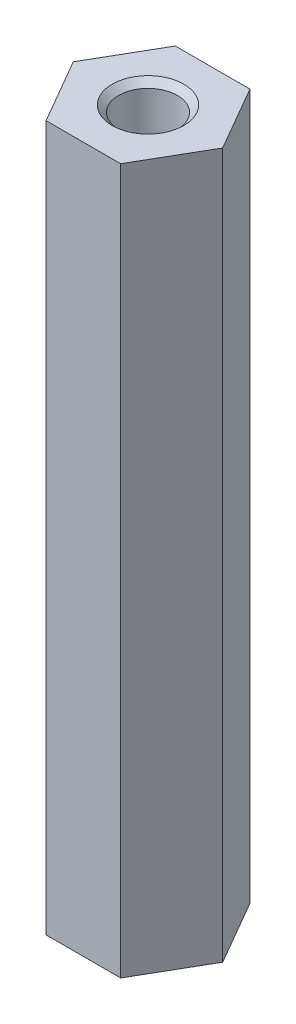
ISO-10303-21;
HEADER;
FILE_DESCRIPTION(('STEP AP214'),'2;1');
FILE_NAME('part.step','',(''),(''),'','','');
FILE_SCHEMA(('AUTOMOTIVE_DESIGN { 1 0 10303 214 1 1 1 1 }'));
ENDSEC;
DATA;
#1=APPLICATION_CONTEXT('core data for automotive mechanical design processes');
#2=APPLICATION_PROTOCOL_DEFINITION('international standard','automotive_design',2000,#1);
#3=PRODUCT_CONTEXT('',#1,'mechanical');
#4=PRODUCT('Part','Part','',(#3));
#5=PRODUCT_RELATED_PRODUCT_CATEGORY('part','',(#4));
#6=PRODUCT_DEFINITION_FORMATION('','',#4);
#7=PRODUCT_DEFINITION_CONTEXT('part definition',#1,'design');
#8=PRODUCT_DEFINITION('design','',#6,#7);
#9=PRODUCT_DEFINITION_SHAPE('','',#8);
#10=(LENGTH_UNIT() NAMED_UNIT(*) SI_UNIT(.MILLI.,.METRE.));
#11=(NAMED_UNIT(*) PLANE_ANGLE_UNIT() SI_UNIT($,.RADIAN.));
#12=(NAMED_UNIT(*) SI_UNIT($,.STERADIAN.) SOLID_ANGLE_UNIT());
#13=UNCERTAINTY_MEASURE_WITH_UNIT(LENGTH_MEASURE(1.E-05),#10,'distance_accuracy_value','');
#14=(GEOMETRIC_REPRESENTATION_CONTEXT(3) GLOBAL_UNCERTAINTY_ASSIGNED_CONTEXT((#13)) GLOBAL_UNIT_ASSIGNED_CONTEXT((#10,
#11,#12)) REPRESENTATION_CONTEXT('',''));
#15=CARTESIAN_POINT('',(0.,0.,0.));
#16=DIRECTION('',(0.,0.,1.));
#17=DIRECTION('',(1.,0.,0.));
#18=AXIS2_PLACEMENT_3D('',#15,#16,#17);
#19=CARTESIAN_POINT('',(1.5877132402715,30.,2.74999999999998));
#20=DIRECTION('',(-0.866025403784441,0.,-0.499999999999995));
#21=DIRECTION('',(-0.499999999999995,0.,0.866025403784441));
#22=AXIS2_PLACEMENT_3D('',#19,#20,#21);
#23=PLANE('',#22);
#24=DIRECTION('',(0.499999999999995,0.,-0.866025403784441));
#25=VECTOR('',#24,1.);
#26=CARTESIAN_POINT('',(1.5877132402715,0.,2.74999999999998));
#27=LINE('',#26,#25);
#28=CARTESIAN_POINT('',(1.5877132402715,0.,2.74999999999998));
#29=VERTEX_POINT('',#28);
#30=CARTESIAN_POINT('',(3.17542648054294,0.,0.));
#31=VERTEX_POINT('',#30);
#32=EDGE_CURVE('E132',#29,#31,#27,.T.);
#33=ORIENTED_EDGE('',*,*,#32,.T.);
#34=DIRECTION('',(0.,-1.,0.));
#35=VECTOR('',#34,1.);
#36=CARTESIAN_POINT('',(3.17542648054294,30.,0.));
#37=LINE('',#36,#35);
#38=CARTESIAN_POINT('',(3.17542648054294,30.,0.));
#39=VERTEX_POINT('',#38);
#40=EDGE_CURVE('E11',#39,#31,#37,.T.);
#41=ORIENTED_EDGE('',*,*,#40,.F.);
#42=DIRECTION('',(0.499999999999995,0.,-0.866025403784441));
#43=VECTOR('',#42,1.);
#44=CARTESIAN_POINT('',(1.5877132402715,30.,2.74999999999998));
#45=LINE('',#44,#43);
#46=CARTESIAN_POINT('',(1.5877132402715,30.,2.74999999999998));
#47=VERTEX_POINT('',#46);
#48=EDGE_CURVE('E143',#47,#39,#45,.T.);
#49=ORIENTED_EDGE('',*,*,#48,.F.);
#50=DIRECTION('',(0.,-1.,0.));
#51=VECTOR('',#50,1.);
#52=CARTESIAN_POINT('',(1.5877132402715,30.,2.74999999999998));
#53=LINE('',#52,#51);
#54=EDGE_CURVE('E128',#47,#29,#53,.T.);
#55=ORIENTED_EDGE('',*,*,#54,.T.);
#56=EDGE_LOOP('',(#33,#41,#49,#55));
#57=FACE_BOUND('',#56,.T.);
#58=ADVANCED_FACE('F45',(#57),#23,.F.);
#59=CARTESIAN_POINT('',(3.17542648054294,30.,0.));
#60=DIRECTION('',(-0.866025403784438,0.,0.500000000000001));
#61=DIRECTION('',(0.500000000000001,0.,0.866025403784438));
#62=AXIS2_PLACEMENT_3D('',#59,#60,#61);
#63=PLANE('',#62);
#64=DIRECTION('',(-0.500000000000001,0.,-0.866025403784438));
#65=VECTOR('',#64,1.);
#66=CARTESIAN_POINT('',(3.17542648054294,0.,0.));
#67=LINE('',#66,#65);
#68=CARTESIAN_POINT('',(1.58771324027147,0.,-2.75000000000001));
#69=VERTEX_POINT('',#68);
#70=EDGE_CURVE('E135',#31,#69,#67,.T.);
#71=ORIENTED_EDGE('',*,*,#70,.T.);
#72=DIRECTION('',(0.,-1.,0.));
#73=VECTOR('',#72,1.);
#74=CARTESIAN_POINT('',(1.58771324027147,30.,-2.75000000000001));
#75=LINE('',#74,#73);
#76=CARTESIAN_POINT('',(1.58771324027147,30.,-2.75000000000001));
#77=VERTEX_POINT('',#76);
#78=EDGE_CURVE('E53',#77,#69,#75,.T.);
#79=ORIENTED_EDGE('',*,*,#78,.F.);
#80=DIRECTION('',(-0.500000000000001,0.,-0.866025403784438));
#81=VECTOR('',#80,1.);
#82=CARTESIAN_POINT('',(3.17542648054294,30.,0.));
#83=LINE('',#82,#81);
#84=EDGE_CURVE('E99',#39,#77,#83,.T.);
#85=ORIENTED_EDGE('',*,*,#84,.F.);
#86=ORIENTED_EDGE('',*,*,#40,.T.);
#87=EDGE_LOOP('',(#71,#79,#85,#86));
#88=FACE_BOUND('',#87,.T.);
#89=ADVANCED_FACE('F169',(#88),#63,.F.);
#90=CARTESIAN_POINT('',(1.58771324027147,30.,-2.75000000000001));
#91=DIRECTION('',(0.,0.,1.));
#92=DIRECTION('',(1.,0.,0.));
#93=AXIS2_PLACEMENT_3D('',#90,#91,#92);
#94=PLANE('',#93);
#95=DIRECTION('',(-1.,0.,0.));
#96=VECTOR('',#95,1.);
#97=CARTESIAN_POINT('',(1.58771324027147,0.,-2.75000000000001));
#98=LINE('',#97,#96);
#99=CARTESIAN_POINT('',(-1.58771324027148,0.,-2.75));
#100=VERTEX_POINT('',#99);
#101=EDGE_CURVE('E138',#69,#100,#98,.T.);
#102=ORIENTED_EDGE('',*,*,#101,.T.);
#103=DIRECTION('',(0.,-1.,0.));
#104=VECTOR('',#103,1.);
#105=CARTESIAN_POINT('',(-1.58771324027148,30.,-2.75));
#106=LINE('',#105,#104);
#107=CARTESIAN_POINT('',(-1.58771324027148,30.,-2.75));
#108=VERTEX_POINT('',#107);
#109=EDGE_CURVE('E123',#108,#100,#106,.T.);
#110=ORIENTED_EDGE('',*,*,#109,.F.);
#111=DIRECTION('',(-1.,0.,0.));
#112=VECTOR('',#111,1.);
#113=CARTESIAN_POINT('',(1.58771324027147,30.,-2.75000000000001));
#114=LINE('',#113,#112);
#115=EDGE_CURVE('E114',#77,#108,#114,.T.);
#116=ORIENTED_EDGE('',*,*,#115,.F.);
#117=ORIENTED_EDGE('',*,*,#78,.T.);
#118=EDGE_LOOP('',(#102,#110,#116,#117));
#119=FACE_BOUND('',#118,.T.);
#120=ADVANCED_FACE('F149',(#119),#94,.F.);
#121=CARTESIAN_POINT('',(-1.58771324027148,30.,-2.75));
#122=DIRECTION('',(0.866025403784442,0.,0.499999999999995));
#123=DIRECTION('',(0.499999999999995,0.,-0.866025403784442));
#124=AXIS2_PLACEMENT_3D('',#121,#122,#123);
#125=PLANE('',#124);
#126=DIRECTION('',(-0.499999999999995,0.,0.866025403784442));
#127=VECTOR('',#126,1.);
#128=CARTESIAN_POINT('',(-1.58771324027148,0.,-2.75));
#129=LINE('',#128,#127);
#130=CARTESIAN_POINT('',(-3.17542648054294,0.,0.));
#131=VERTEX_POINT('',#130);
#132=EDGE_CURVE('E122',#100,#131,#129,.T.);
#133=ORIENTED_EDGE('',*,*,#132,.T.);
#134=DIRECTION('',(0.,-1.,0.));
#135=VECTOR('',#134,1.);
#136=CARTESIAN_POINT('',(-3.17542648054294,30.,0.));
#137=LINE('',#136,#135);
#138=CARTESIAN_POINT('',(-3.17542648054294,30.,0.));
#139=VERTEX_POINT('',#138);
#140=EDGE_CURVE('E119',#139,#131,#137,.T.);
#141=ORIENTED_EDGE('',*,*,#140,.F.);
#142=DIRECTION('',(-0.499999999999995,0.,0.866025403784442));
#143=VECTOR('',#142,1.);
#144=CARTESIAN_POINT('',(-1.58771324027148,30.,-2.75));
#145=LINE('',#144,#143);
#146=EDGE_CURVE('E108',#108,#139,#145,.T.);
#147=ORIENTED_EDGE('',*,*,#146,.F.);
#148=ORIENTED_EDGE('',*,*,#109,.T.);
#149=EDGE_LOOP('',(#133,#141,#147,#148));
#150=FACE_BOUND('',#149,.T.);
#151=ADVANCED_FACE('F120',(#150),#125,.F.);
#152=CARTESIAN_POINT('',(-3.17542648054294,30.,0.));
#153=DIRECTION('',(0.866025403784435,0.,-0.500000000000007));
#154=DIRECTION('',(-0.500000000000007,0.,-0.866025403784435));
#155=AXIS2_PLACEMENT_3D('',#152,#153,#154);
#156=PLANE('',#155);
#157=DIRECTION('',(0.500000000000007,0.,0.866025403784435));
#158=VECTOR('',#157,1.);
#159=CARTESIAN_POINT('',(-3.17542648054294,0.,0.));
#160=LINE('',#159,#158);
#161=CARTESIAN_POINT('',(-1.58771324027145,0.,2.75000000000002));
#162=VERTEX_POINT('',#161);
#163=EDGE_CURVE('E85',#131,#162,#160,.T.);
#164=ORIENTED_EDGE('',*,*,#163,.T.);
#165=DIRECTION('',(0.,-1.,0.));
#166=VECTOR('',#165,1.);
#167=CARTESIAN_POINT('',(-1.58771324027145,30.,2.75000000000002));
#168=LINE('',#167,#166);
#169=CARTESIAN_POINT('',(-1.58771324027145,30.,2.75000000000002));
#170=VERTEX_POINT('',#169);
#171=EDGE_CURVE('E124',#170,#162,#168,.T.);
#172=ORIENTED_EDGE('',*,*,#171,.F.);
#173=DIRECTION('',(0.500000000000007,0.,0.866025403784435));
#174=VECTOR('',#173,1.);
#175=CARTESIAN_POINT('',(-3.17542648054294,30.,0.));
#176=LINE('',#175,#174);
#177=EDGE_CURVE('E112',#139,#170,#176,.T.);
#178=ORIENTED_EDGE('',*,*,#177,.F.);
#179=ORIENTED_EDGE('',*,*,#140,.T.);
#180=EDGE_LOOP('',(#164,#172,#178,#179));
#181=FACE_BOUND('',#180,.T.);
#182=ADVANCED_FACE('F126',(#181),#156,.F.);
#183=CARTESIAN_POINT('',(-1.58771324027145,30.,2.75000000000002));
#184=DIRECTION('',(0.,0.,-1.));
#185=DIRECTION('',(-1.,0.,0.));
#186=AXIS2_PLACEMENT_3D('',#183,#184,#185);
#187=PLANE('',#186);
#188=DIRECTION('',(1.,0.,0.));
#189=VECTOR('',#188,1.);
#190=CARTESIAN_POINT('',(-1.58771324027145,0.,2.75000000000002));
#191=LINE('',#190,#189);
#192=EDGE_CURVE('E91',#162,#29,#191,.T.);
#193=ORIENTED_EDGE('',*,*,#192,.T.);
#194=ORIENTED_EDGE('',*,*,#54,.F.);
#195=DIRECTION('',(1.,0.,0.));
#196=VECTOR('',#195,1.);
#197=CARTESIAN_POINT('',(-1.58771324027145,30.,2.75000000000002));
#198=LINE('',#197,#196);
#199=EDGE_CURVE('E61',#170,#47,#198,.T.);
#200=ORIENTED_EDGE('',*,*,#199,.F.);
#201=ORIENTED_EDGE('',*,*,#171,.T.);
#202=EDGE_LOOP('',(#193,#194,#200,#201));
#203=FACE_BOUND('',#202,.T.);
#204=ADVANCED_FACE('F156',(#203),#187,.F.);
#205=CARTESIAN_POINT('',(0.,30.,0.));
#206=DIRECTION('',(0.,1.,0.));
#207=DIRECTION('',(0.,0.,1.));
#208=AXIS2_PLACEMENT_3D('',#205,#206,#207);
#209=PLANE('',#208);
#210=CARTESIAN_POINT('',(0.,30.,0.));
#211=DIRECTION('',(0.,1.,0.));
#212=DIRECTION('',(0.,0.,1.));
#213=AXIS2_PLACEMENT_3D('',#210,#211,#212);
#214=CIRCLE('',#213,1.525);
#215=CARTESIAN_POINT('',(0.,30.,1.525));
#216=VERTEX_POINT('',#215);
#217=EDGE_CURVE('E300',#216,#216,#214,.T.);
#218=ORIENTED_EDGE('',*,*,#217,.F.);
#219=EDGE_LOOP('',(#218));
#220=FACE_BOUND('',#219,.T.);
#221=ORIENTED_EDGE('',*,*,#48,.T.);
#222=ORIENTED_EDGE('',*,*,#84,.T.);
#223=ORIENTED_EDGE('',*,*,#115,.T.);
#224=ORIENTED_EDGE('',*,*,#146,.T.);
#225=ORIENTED_EDGE('',*,*,#177,.T.);
#226=ORIENTED_EDGE('',*,*,#199,.T.);
#227=EDGE_LOOP('',(#221,#222,#223,#224,#225,#226));
#228=FACE_BOUND('',#227,.T.);
#229=ADVANCED_FACE('F110',(#220,#228),#209,.T.);
#230=CARTESIAN_POINT('',(0.,0.,0.));
#231=DIRECTION('',(0.,1.,0.));
#232=DIRECTION('',(0.,0.,1.));
#233=AXIS2_PLACEMENT_3D('',#230,#231,#232);
#234=PLANE('',#233);
#235=CARTESIAN_POINT('',(0.,0.,0.));
#236=DIRECTION('',(0.,-1.,0.));
#237=DIRECTION('',(0.,0.,-1.));
#238=AXIS2_PLACEMENT_3D('',#235,#236,#237);
#239=CIRCLE('',#238,1.525);
#240=CARTESIAN_POINT('',(0.,0.,-1.525));
#241=VERTEX_POINT('',#240);
#242=EDGE_CURVE('E293',#241,#241,#239,.T.);
#243=ORIENTED_EDGE('',*,*,#242,.F.);
#244=EDGE_LOOP('',(#243));
#245=FACE_BOUND('',#244,.T.);
#246=ORIENTED_EDGE('',*,*,#32,.F.);
#247=ORIENTED_EDGE('',*,*,#192,.F.);
#248=ORIENTED_EDGE('',*,*,#163,.F.);
#249=ORIENTED_EDGE('',*,*,#132,.F.);
#250=ORIENTED_EDGE('',*,*,#101,.F.);
#251=ORIENTED_EDGE('',*,*,#70,.F.);
#252=EDGE_LOOP('',(#246,#247,#248,#249,#250,#251));
#253=FACE_BOUND('',#252,.T.);
#254=ADVANCED_FACE('F152',(#245,#253),#234,.F.);
#255=CARTESIAN_POINT('',(0.,20.,0.));
#256=DIRECTION('',(0.,1.,0.));
#257=DIRECTION('',(0.,0.,1.));
#258=AXIS2_PLACEMENT_3D('',#255,#256,#257);
#259=CONICAL_SURFACE('',#258,1.24999999999999,1.02974425867665);
#260=CARTESIAN_POINT('',(0.,19.2489242262156,0.));
#261=VERTEX_POINT('',#260);
#262=VERTEX_LOOP('',#261);
#263=FACE_BOUND('',#262,.T.);
#264=CARTESIAN_POINT('',(0.,20.,0.));
#265=DIRECTION('',(0.,1.,0.));
#266=DIRECTION('',(0.,0.,1.));
#267=AXIS2_PLACEMENT_3D('',#264,#265,#266);
#268=CIRCLE('',#267,1.24999999999999);
#269=CARTESIAN_POINT('',(0.,20.,1.24999999999999));
#270=VERTEX_POINT('',#269);
#271=EDGE_CURVE('E136',#270,#270,#268,.T.);
#272=ORIENTED_EDGE('',*,*,#271,.T.);
#273=EDGE_LOOP('',(#272));
#274=FACE_BOUND('',#273,.T.);
#275=ADVANCED_FACE('F210',(#263,#274),#259,.F.);
#276=CARTESIAN_POINT('',(0.,30.,0.));
#277=DIRECTION('',(0.,1.,0.));
#278=DIRECTION('',(0.,0.,1.));
#279=AXIS2_PLACEMENT_3D('',#276,#277,#278);
#280=CYLINDRICAL_SURFACE('',#279,1.24999999999999);
#281=ORIENTED_EDGE('',*,*,#271,.F.);
#282=EDGE_LOOP('',(#281));
#283=FACE_BOUND('',#282,.T.);
#284=CARTESIAN_POINT('',(0.,29.725,0.));
#285=DIRECTION('',(0.,1.,0.));
#286=DIRECTION('',(0.,0.,1.));
#287=AXIS2_PLACEMENT_3D('',#284,#285,#286);
#288=CIRCLE('',#287,1.25);
#289=CARTESIAN_POINT('',(0.,29.725,1.25));
#290=VERTEX_POINT('',#289);
#291=EDGE_CURVE('E303',#290,#290,#288,.T.);
#292=ORIENTED_EDGE('',*,*,#291,.T.);
#293=EDGE_LOOP('',(#292));
#294=FACE_BOUND('',#293,.T.);
#295=ADVANCED_FACE('F220',(#283,#294),#280,.F.);
#296=CARTESIAN_POINT('',(0.,30.,0.));
#297=DIRECTION('',(0.,1.,0.));
#298=DIRECTION('',(0.,0.,1.));
#299=AXIS2_PLACEMENT_3D('',#296,#297,#298);
#300=CONICAL_SURFACE('',#299,1.525,0.785398163397444);
#301=ORIENTED_EDGE('',*,*,#291,.F.);
#302=EDGE_LOOP('',(#301));
#303=FACE_BOUND('',#302,.T.);
#304=ORIENTED_EDGE('',*,*,#217,.T.);
#305=EDGE_LOOP('',(#304));
#306=FACE_BOUND('',#305,.T.);
#307=ADVANCED_FACE('F231',(#303,#306),#300,.F.);
#308=CARTESIAN_POINT('',(0.,9.99999999999999,0.));
#309=DIRECTION('',(0.,-1.,0.));
#310=DIRECTION('',(0.,0.,-1.));
#311=AXIS2_PLACEMENT_3D('',#308,#309,#310);
#312=CONICAL_SURFACE('',#311,1.24999999999999,1.02974425867665);
#313=CARTESIAN_POINT('',(0.,10.7510757737845,0.));
#314=VERTEX_POINT('',#313);
#315=VERTEX_LOOP('',#314);
#316=FACE_BOUND('',#315,.T.);
#317=CARTESIAN_POINT('',(0.,9.99999999999999,0.));
#318=DIRECTION('',(0.,-1.,0.));
#319=DIRECTION('',(0.,0.,-1.));
#320=AXIS2_PLACEMENT_3D('',#317,#318,#319);
#321=CIRCLE('',#320,1.24999999999999);
#322=CARTESIAN_POINT('',(0.,9.99999999999999,-1.24999999999999));
#323=VERTEX_POINT('',#322);
#324=EDGE_CURVE('E295',#323,#323,#321,.T.);
#325=ORIENTED_EDGE('',*,*,#324,.T.);
#326=EDGE_LOOP('',(#325));
#327=FACE_BOUND('',#326,.T.);
#328=ADVANCED_FACE('F242',(#316,#327),#312,.F.);
#329=CARTESIAN_POINT('',(0.,0.,0.));
#330=DIRECTION('',(0.,-1.,0.));
#331=DIRECTION('',(0.,0.,-1.));
#332=AXIS2_PLACEMENT_3D('',#329,#330,#331);
#333=CYLINDRICAL_SURFACE('',#332,1.24999999999999);
#334=ORIENTED_EDGE('',*,*,#324,.F.);
#335=EDGE_LOOP('',(#334));
#336=FACE_BOUND('',#335,.T.);
#337=CARTESIAN_POINT('',(0.,0.274999999999997,0.));
#338=DIRECTION('',(0.,-1.,0.));
#339=DIRECTION('',(0.,0.,-1.));
#340=AXIS2_PLACEMENT_3D('',#337,#338,#339);
#341=CIRCLE('',#340,1.24999999999999);
#342=CARTESIAN_POINT('',(0.,0.274999999999997,-1.24999999999999));
#343=VERTEX_POINT('',#342);
#344=EDGE_CURVE('E290',#343,#343,#341,.T.);
#345=ORIENTED_EDGE('',*,*,#344,.T.);
#346=EDGE_LOOP('',(#345));
#347=FACE_BOUND('',#346,.T.);
#348=ADVANCED_FACE('F251',(#336,#347),#333,.F.);
#349=CARTESIAN_POINT('',(0.,0.,0.));
#350=DIRECTION('',(0.,-1.,0.));
#351=DIRECTION('',(0.,0.,-1.));
#352=AXIS2_PLACEMENT_3D('',#349,#350,#351);
#353=CONICAL_SURFACE('',#352,1.525,0.78539816339747);
#354=ORIENTED_EDGE('',*,*,#344,.F.);
#355=EDGE_LOOP('',(#354));
#356=FACE_BOUND('',#355,.T.);
#357=ORIENTED_EDGE('',*,*,#242,.T.);
#358=EDGE_LOOP('',(#357));
#359=FACE_BOUND('',#358,.T.);
#360=ADVANCED_FACE('F262',(#356,#359),#353,.F.);
#361=CLOSED_SHELL('',(#58,#89,#120,#151,#182,#204,#229,#254,#275,#295,#307,#328,#348,#360));
#362=MANIFOLD_SOLID_BREP('B2',#361);
#363=ADVANCED_BREP_SHAPE_REPRESENTATION('',(#18,#362),#14);
#364=SHAPE_DEFINITION_REPRESENTATION(#9,#363);
ENDSEC;
END-ISO-10303-21;
